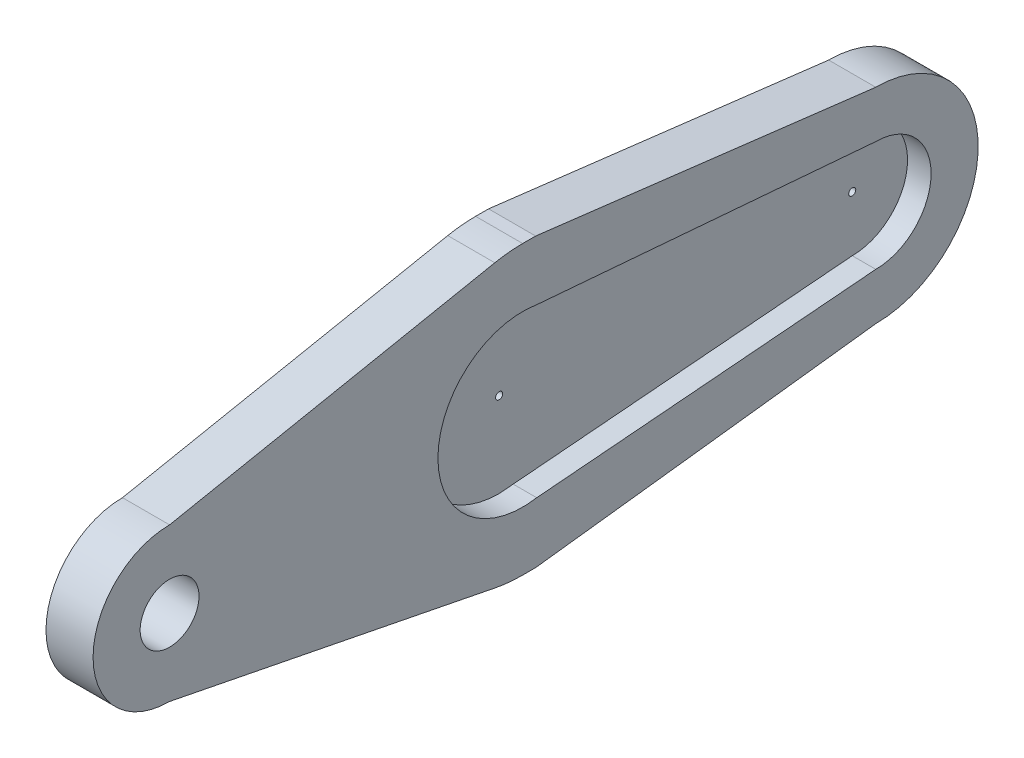
ISO-10303-21;
HEADER;
FILE_DESCRIPTION(('STEP AP214'),'2;1');
FILE_NAME('part.step','',(''),(''),'','','');
FILE_SCHEMA(('AUTOMOTIVE_DESIGN { 1 0 10303 214 1 1 1 1 }'));
ENDSEC;
DATA;
#1=APPLICATION_CONTEXT('core data for automotive mechanical design processes');
#2=APPLICATION_PROTOCOL_DEFINITION('international standard','automotive_design',2000,#1);
#3=PRODUCT_CONTEXT('',#1,'mechanical');
#4=PRODUCT('Part','Part','',(#3));
#5=PRODUCT_RELATED_PRODUCT_CATEGORY('part','',(#4));
#6=PRODUCT_DEFINITION_FORMATION('','',#4);
#7=PRODUCT_DEFINITION_CONTEXT('part definition',#1,'design');
#8=PRODUCT_DEFINITION('design','',#6,#7);
#9=PRODUCT_DEFINITION_SHAPE('','',#8);
#10=(LENGTH_UNIT() NAMED_UNIT(*) SI_UNIT(.MILLI.,.METRE.));
#11=(NAMED_UNIT(*) PLANE_ANGLE_UNIT() SI_UNIT($,.RADIAN.));
#12=(NAMED_UNIT(*) SI_UNIT($,.STERADIAN.) SOLID_ANGLE_UNIT());
#13=UNCERTAINTY_MEASURE_WITH_UNIT(LENGTH_MEASURE(1.E-05),#10,'distance_accuracy_value','');
#14=(GEOMETRIC_REPRESENTATION_CONTEXT(3) GLOBAL_UNCERTAINTY_ASSIGNED_CONTEXT((#13)) GLOBAL_UNIT_ASSIGNED_CONTEXT((#10,
#11,#12)) REPRESENTATION_CONTEXT('',''));
#15=CARTESIAN_POINT('',(0.,0.,0.));
#16=DIRECTION('',(0.,0.,1.));
#17=DIRECTION('',(1.,0.,0.));
#18=AXIS2_PLACEMENT_3D('',#15,#16,#17);
#19=CARTESIAN_POINT('',(2.,0.,0.549999999999999));
#20=DIRECTION('',(-1.,0.,0.));
#21=DIRECTION('',(0.,0.,1.));
#22=AXIS2_PLACEMENT_3D('',#19,#20,#21);
#23=CYLINDRICAL_SURFACE('',#22,3.6);
#24=CARTESIAN_POINT('',(0.,0.,0.549999999999999));
#25=DIRECTION('',(1.,0.,0.));
#26=DIRECTION('',(0.,0.,-1.));
#27=AXIS2_PLACEMENT_3D('',#24,#25,#26);
#28=CIRCLE('',#27,3.6);
#29=CARTESIAN_POINT('',(0.,-3.6,0.549999999999999));
#30=VERTEX_POINT('',#29);
#31=CARTESIAN_POINT('',(0.,-3.55034482758621,-0.0458620689654888));
#32=VERTEX_POINT('',#31);
#33=EDGE_CURVE('E189',#30,#32,#28,.T.);
#34=ORIENTED_EDGE('',*,*,#33,.F.);
#35=DIRECTION('',(-1.,0.,0.));
#36=VECTOR('',#35,1.);
#37=CARTESIAN_POINT('',(1.,-3.6,0.549999999999999));
#38=LINE('',#37,#36);
#39=CARTESIAN_POINT('',(1.,-3.6,0.549999999999999));
#40=VERTEX_POINT('',#39);
#41=EDGE_CURVE('E324',#40,#30,#38,.T.);
#42=ORIENTED_EDGE('',*,*,#41,.F.);
#43=CARTESIAN_POINT('',(1.,0.,0.549999999999999));
#44=DIRECTION('',(1.,0.,0.));
#45=DIRECTION('',(0.,0.,-1.));
#46=AXIS2_PLACEMENT_3D('',#43,#44,#45);
#47=CIRCLE('',#46,3.6);
#48=CARTESIAN_POINT('',(1.,3.6,0.549999999999999));
#49=VERTEX_POINT('',#48);
#50=EDGE_CURVE('E305',#49,#40,#47,.T.);
#51=ORIENTED_EDGE('',*,*,#50,.F.);
#52=DIRECTION('',(-1.,0.,0.));
#53=VECTOR('',#52,1.);
#54=CARTESIAN_POINT('',(1.,3.6,0.549999999999999));
#55=LINE('',#54,#53);
#56=CARTESIAN_POINT('',(0.,3.6,0.549999999999999));
#57=VERTEX_POINT('',#56);
#58=EDGE_CURVE('E332',#49,#57,#55,.T.);
#59=ORIENTED_EDGE('',*,*,#58,.T.);
#60=CARTESIAN_POINT('',(0.,3.55034482758621,-0.0458620689654861));
#61=VERTEX_POINT('',#60);
#62=EDGE_CURVE('E191',#61,#57,#28,.T.);
#63=ORIENTED_EDGE('',*,*,#62,.F.);
#64=DIRECTION('',(-1.,0.,0.));
#65=VECTOR('',#64,1.);
#66=CARTESIAN_POINT('',(2.,3.55034482758621,-0.0458620689654944));
#67=LINE('',#66,#65);
#68=CARTESIAN_POINT('',(1.,3.55034482758621,-0.0458620689654861));
#69=VERTEX_POINT('',#68);
#70=EDGE_CURVE('E301',#61,#69,#67,.F.);
#71=ORIENTED_EDGE('',*,*,#70,.T.);
#72=DIRECTION('',(-1.,0.,0.));
#73=VECTOR('',#72,1.);
#74=CARTESIAN_POINT('',(2.,3.55034482758621,-0.0458620689654861));
#75=LINE('',#74,#73);
#76=CARTESIAN_POINT('',(2.,3.55034482758621,-0.0458620689654861));
#77=VERTEX_POINT('',#76);
#78=EDGE_CURVE('E255',#77,#69,#75,.T.);
#79=ORIENTED_EDGE('',*,*,#78,.F.);
#80=CARTESIAN_POINT('',(2.,0.,0.549999999999999));
#81=DIRECTION('',(1.,0.,0.));
#82=DIRECTION('',(0.,0.,-1.));
#83=AXIS2_PLACEMENT_3D('',#80,#81,#82);
#84=CIRCLE('',#83,3.6);
#85=CARTESIAN_POINT('',(2.,-3.55034482758621,-0.0458620689654945));
#86=VERTEX_POINT('',#85);
#87=EDGE_CURVE('E347',#77,#86,#84,.T.);
#88=ORIENTED_EDGE('',*,*,#87,.T.);
#89=DIRECTION('',(-1.,0.,0.));
#90=VECTOR('',#89,1.);
#91=CARTESIAN_POINT('',(2.,-3.55034482758621,-0.0458620689654945));
#92=LINE('',#91,#90);
#93=CARTESIAN_POINT('',(1.,-3.55034482758621,-0.0458620689654945));
#94=VERTEX_POINT('',#93);
#95=EDGE_CURVE('E258',#86,#94,#92,.T.);
#96=ORIENTED_EDGE('',*,*,#95,.T.);
#97=DIRECTION('',(-1.,0.,0.));
#98=VECTOR('',#97,1.);
#99=CARTESIAN_POINT('',(2.,-3.55034482758621,-0.0458620689654999));
#100=LINE('',#99,#98);
#101=EDGE_CURVE('E190',#94,#32,#100,.T.);
#102=ORIENTED_EDGE('',*,*,#101,.T.);
#103=EDGE_LOOP('',(#34,#42,#51,#59,#63,#71,#79,#88,#96,#102));
#104=FACE_BOUND('',#103,.T.);
#105=ADVANCED_FACE('F43',(#104),#23,.F.);
#106=CARTESIAN_POINT('',(2.,6.1,0.));
#107=DIRECTION('',(0.,-1.,0.));
#108=DIRECTION('',(0.,0.,-1.));
#109=AXIS2_PLACEMENT_3D('',#106,#107,#108);
#110=PLANE('',#109);
#111=DIRECTION('',(0.,0.,1.));
#112=VECTOR('',#111,1.);
#113=CARTESIAN_POINT('',(0.,6.1,0.));
#114=LINE('',#113,#112);
#115=CARTESIAN_POINT('',(0.,6.1,0.));
#116=VERTEX_POINT('',#115);
#117=CARTESIAN_POINT('',(0.,6.1,0.549999999999999));
#118=VERTEX_POINT('',#117);
#119=EDGE_CURVE('E195',#116,#118,#114,.T.);
#120=ORIENTED_EDGE('',*,*,#119,.T.);
#121=DIRECTION('',(-1.,0.,0.));
#122=VECTOR('',#121,1.);
#123=CARTESIAN_POINT('',(2.,6.1,0.549999999999999));
#124=LINE('',#123,#122);
#125=CARTESIAN_POINT('',(2.,6.1,0.549999999999999));
#126=VERTEX_POINT('',#125);
#127=EDGE_CURVE('E11',#126,#118,#124,.T.);
#128=ORIENTED_EDGE('',*,*,#127,.F.);
#129=DIRECTION('',(0.,0.,1.));
#130=VECTOR('',#129,1.);
#131=CARTESIAN_POINT('',(2.,6.1,0.));
#132=LINE('',#131,#130);
#133=CARTESIAN_POINT('',(2.,6.1,0.));
#134=VERTEX_POINT('',#133);
#135=EDGE_CURVE('E354',#134,#126,#132,.T.);
#136=ORIENTED_EDGE('',*,*,#135,.F.);
#137=DIRECTION('',(-1.,0.,0.));
#138=VECTOR('',#137,1.);
#139=CARTESIAN_POINT('',(2.,6.1,0.));
#140=LINE('',#139,#138);
#141=EDGE_CURVE('E227',#134,#116,#140,.T.);
#142=ORIENTED_EDGE('',*,*,#141,.T.);
#143=EDGE_LOOP('',(#120,#128,#136,#142));
#144=FACE_BOUND('',#143,.T.);
#145=ADVANCED_FACE('F384',(#144),#110,.F.);
#146=CARTESIAN_POINT('',(2.,0.,0.549999999999999));
#147=DIRECTION('',(-1.,0.,0.));
#148=DIRECTION('',(0.,0.,1.));
#149=AXIS2_PLACEMENT_3D('',#146,#147,#148);
#150=CYLINDRICAL_SURFACE('',#149,6.1);
#151=CARTESIAN_POINT('',(0.,0.,0.549999999999999));
#152=DIRECTION('',(1.,0.,0.));
#153=DIRECTION('',(0.,0.,-1.));
#154=AXIS2_PLACEMENT_3D('',#151,#152,#153);
#155=CIRCLE('',#154,6.1);
#156=CARTESIAN_POINT('',(0.,5.98396265759772,1.73414142418716));
#157=VERTEX_POINT('',#156);
#158=EDGE_CURVE('E199',#118,#157,#155,.T.);
#159=ORIENTED_EDGE('',*,*,#158,.T.);
#160=DIRECTION('',(-1.,0.,0.));
#161=VECTOR('',#160,1.);
#162=CARTESIAN_POINT('',(2.,5.98396265759772,1.73414142418716));
#163=LINE('',#162,#161);
#164=CARTESIAN_POINT('',(2.,5.98396265759772,1.73414142418716));
#165=VERTEX_POINT('',#164);
#166=EDGE_CURVE('E53',#165,#157,#163,.T.);
#167=ORIENTED_EDGE('',*,*,#166,.F.);
#168=CARTESIAN_POINT('',(2.,0.,0.549999999999999));
#169=DIRECTION('',(1.,0.,0.));
#170=DIRECTION('',(0.,0.,-1.));
#171=AXIS2_PLACEMENT_3D('',#168,#169,#170);
#172=CIRCLE('',#171,6.1);
#173=EDGE_CURVE('E357',#126,#165,#172,.T.);
#174=ORIENTED_EDGE('',*,*,#173,.F.);
#175=ORIENTED_EDGE('',*,*,#127,.T.);
#176=EDGE_LOOP('',(#159,#167,#174,#175));
#177=FACE_BOUND('',#176,.T.);
#178=ADVANCED_FACE('F389',(#177),#150,.T.);
#179=CARTESIAN_POINT('',(2.,6.08869853330339,1.20486717000446));
#180=DIRECTION('',(0.,-0.980977484852086,-0.194121544948715));
#181=DIRECTION('',(0.,0.194121544948715,-0.980977484852086));
#182=AXIS2_PLACEMENT_3D('',#179,#180,#181);
#183=PLANE('',#182);
#184=DIRECTION('',(0.,-0.194121544948715,0.980977484852086));
#185=VECTOR('',#184,1.);
#186=CARTESIAN_POINT('',(0.,6.08869853330339,1.20486717000446));
#187=LINE('',#186,#185);
#188=CARTESIAN_POINT('',(0.,3.25,15.55));
#189=VERTEX_POINT('',#188);
#190=EDGE_CURVE('E202',#157,#189,#187,.T.);
#191=ORIENTED_EDGE('',*,*,#190,.T.);
#192=DIRECTION('',(-1.,0.,0.));
#193=VECTOR('',#192,1.);
#194=CARTESIAN_POINT('',(2.,3.25,15.55));
#195=LINE('',#194,#193);
#196=CARTESIAN_POINT('',(2.,3.25,15.55));
#197=VERTEX_POINT('',#196);
#198=EDGE_CURVE('E245',#197,#189,#195,.T.);
#199=ORIENTED_EDGE('',*,*,#198,.F.);
#200=DIRECTION('',(0.,-0.194121544948715,0.980977484852086));
#201=VECTOR('',#200,1.);
#202=CARTESIAN_POINT('',(2.,6.08869853330339,1.20486717000446));
#203=LINE('',#202,#201);
#204=EDGE_CURVE('E360',#165,#197,#203,.T.);
#205=ORIENTED_EDGE('',*,*,#204,.F.);
#206=ORIENTED_EDGE('',*,*,#166,.T.);
#207=EDGE_LOOP('',(#191,#199,#205,#206));
#208=FACE_BOUND('',#207,.T.);
#209=ADVANCED_FACE('F392',(#208),#183,.F.);
#210=CARTESIAN_POINT('',(2.,0.,15.55));
#211=DIRECTION('',(-1.,0.,0.));
#212=DIRECTION('',(0.,0.,1.));
#213=AXIS2_PLACEMENT_3D('',#210,#211,#212);
#214=CYLINDRICAL_SURFACE('',#213,3.25);
#215=CARTESIAN_POINT('',(0.,0.,15.55));
#216=DIRECTION('',(1.,0.,0.));
#217=DIRECTION('',(0.,0.,-1.));
#218=AXIS2_PLACEMENT_3D('',#215,#216,#217);
#219=CIRCLE('',#218,3.25);
#220=CARTESIAN_POINT('',(0.,-3.25,15.55));
#221=VERTEX_POINT('',#220);
#222=EDGE_CURVE('E205',#189,#221,#219,.T.);
#223=ORIENTED_EDGE('',*,*,#222,.T.);
#224=DIRECTION('',(-1.,0.,0.));
#225=VECTOR('',#224,1.);
#226=CARTESIAN_POINT('',(2.,-3.25,15.55));
#227=LINE('',#226,#225);
#228=CARTESIAN_POINT('',(2.,-3.25,15.55));
#229=VERTEX_POINT('',#228);
#230=EDGE_CURVE('E241',#229,#221,#227,.T.);
#231=ORIENTED_EDGE('',*,*,#230,.F.);
#232=CARTESIAN_POINT('',(2.,0.,15.55));
#233=DIRECTION('',(1.,0.,0.));
#234=DIRECTION('',(0.,0.,-1.));
#235=AXIS2_PLACEMENT_3D('',#232,#233,#234);
#236=CIRCLE('',#235,3.25);
#237=EDGE_CURVE('E363',#197,#229,#236,.T.);
#238=ORIENTED_EDGE('',*,*,#237,.F.);
#239=ORIENTED_EDGE('',*,*,#198,.T.);
#240=EDGE_LOOP('',(#223,#231,#238,#239));
#241=FACE_BOUND('',#240,.T.);
#242=ADVANCED_FACE('F397',(#241),#214,.T.);
#243=CARTESIAN_POINT('',(2.,-6.08869853330339,1.20486717000446));
#244=DIRECTION('',(0.,0.980977484852086,-0.194121544948715));
#245=DIRECTION('',(0.,0.194121544948715,0.980977484852086));
#246=AXIS2_PLACEMENT_3D('',#243,#244,#245);
#247=PLANE('',#246);
#248=DIRECTION('',(0.,-0.194121544948715,-0.980977484852086));
#249=VECTOR('',#248,1.);
#250=CARTESIAN_POINT('',(0.,-6.08869853330339,1.20486717000446));
#251=LINE('',#250,#249);
#252=CARTESIAN_POINT('',(0.,-5.98396265759773,1.73414142418716));
#253=VERTEX_POINT('',#252);
#254=EDGE_CURVE('E208',#221,#253,#251,.T.);
#255=ORIENTED_EDGE('',*,*,#254,.T.);
#256=DIRECTION('',(-1.,0.,0.));
#257=VECTOR('',#256,1.);
#258=CARTESIAN_POINT('',(2.,-5.98396265759773,1.73414142418716));
#259=LINE('',#258,#257);
#260=CARTESIAN_POINT('',(2.,-5.98396265759773,1.73414142418716));
#261=VERTEX_POINT('',#260);
#262=EDGE_CURVE('E237',#261,#253,#259,.T.);
#263=ORIENTED_EDGE('',*,*,#262,.F.);
#264=DIRECTION('',(0.,-0.194121544948715,-0.980977484852086));
#265=VECTOR('',#264,1.);
#266=CARTESIAN_POINT('',(2.,-6.08869853330339,1.20486717000446));
#267=LINE('',#266,#265);
#268=EDGE_CURVE('E366',#229,#261,#267,.T.);
#269=ORIENTED_EDGE('',*,*,#268,.F.);
#270=ORIENTED_EDGE('',*,*,#230,.T.);
#271=EDGE_LOOP('',(#255,#263,#269,#270));
#272=FACE_BOUND('',#271,.T.);
#273=ADVANCED_FACE('F402',(#272),#247,.F.);
#274=CARTESIAN_POINT('',(2.,0.,0.549999999999999));
#275=DIRECTION('',(-1.,0.,0.));
#276=DIRECTION('',(0.,0.,1.));
#277=AXIS2_PLACEMENT_3D('',#274,#275,#276);
#278=CYLINDRICAL_SURFACE('',#277,6.1);
#279=CARTESIAN_POINT('',(0.,0.,0.549999999999999));
#280=DIRECTION('',(1.,0.,0.));
#281=DIRECTION('',(0.,0.,-1.));
#282=AXIS2_PLACEMENT_3D('',#279,#280,#281);
#283=CIRCLE('',#282,6.1);
#284=CARTESIAN_POINT('',(0.,-6.1,0.549999999999999));
#285=VERTEX_POINT('',#284);
#286=EDGE_CURVE('E211',#253,#285,#283,.T.);
#287=ORIENTED_EDGE('',*,*,#286,.T.);
#288=DIRECTION('',(-1.,0.,0.));
#289=VECTOR('',#288,1.);
#290=CARTESIAN_POINT('',(2.,-6.1,0.549999999999999));
#291=LINE('',#290,#289);
#292=CARTESIAN_POINT('',(2.,-6.1,0.549999999999999));
#293=VERTEX_POINT('',#292);
#294=EDGE_CURVE('E234',#293,#285,#291,.T.);
#295=ORIENTED_EDGE('',*,*,#294,.F.);
#296=CARTESIAN_POINT('',(2.,0.,0.549999999999999));
#297=DIRECTION('',(1.,0.,0.));
#298=DIRECTION('',(0.,0.,-1.));
#299=AXIS2_PLACEMENT_3D('',#296,#297,#298);
#300=CIRCLE('',#299,6.1);
#301=EDGE_CURVE('E369',#261,#293,#300,.T.);
#302=ORIENTED_EDGE('',*,*,#301,.F.);
#303=ORIENTED_EDGE('',*,*,#262,.T.);
#304=EDGE_LOOP('',(#287,#295,#302,#303));
#305=FACE_BOUND('',#304,.T.);
#306=ADVANCED_FACE('F405',(#305),#278,.T.);
#307=CARTESIAN_POINT('',(2.,-6.1,0.));
#308=DIRECTION('',(0.,-1.,0.));
#309=DIRECTION('',(0.,0.,-1.));
#310=AXIS2_PLACEMENT_3D('',#307,#308,#309);
#311=PLANE('',#310);
#312=DIRECTION('',(0.,0.,1.));
#313=VECTOR('',#312,1.);
#314=CARTESIAN_POINT('',(0.,-6.1,0.));
#315=LINE('',#314,#313);
#316=CARTESIAN_POINT('',(0.,-6.1,0.));
#317=VERTEX_POINT('',#316);
#318=EDGE_CURVE('E215',#317,#285,#315,.T.);
#319=ORIENTED_EDGE('',*,*,#318,.F.);
#320=DIRECTION('',(-1.,0.,0.));
#321=VECTOR('',#320,1.);
#322=CARTESIAN_POINT('',(2.,-6.1,0.));
#323=LINE('',#322,#321);
#324=CARTESIAN_POINT('',(2.,-6.1,0.));
#325=VERTEX_POINT('',#324);
#326=EDGE_CURVE('E174',#325,#317,#323,.T.);
#327=ORIENTED_EDGE('',*,*,#326,.F.);
#328=DIRECTION('',(0.,0.,1.));
#329=VECTOR('',#328,1.);
#330=CARTESIAN_POINT('',(2.,-6.1,0.));
#331=LINE('',#330,#329);
#332=EDGE_CURVE('E162',#325,#293,#331,.T.);
#333=ORIENTED_EDGE('',*,*,#332,.T.);
#334=ORIENTED_EDGE('',*,*,#294,.T.);
#335=EDGE_LOOP('',(#319,#327,#333,#334));
#336=FACE_BOUND('',#335,.T.);
#337=ADVANCED_FACE('F374',(#336),#311,.T.);
#338=CARTESIAN_POINT('',(2.,-6.01182474689071,-0.728075661388148));
#339=DIRECTION('',(0.,0.992746211513238,0.12022877994105));
#340=DIRECTION('',(0.,-0.12022877994105,0.992746211513238));
#341=AXIS2_PLACEMENT_3D('',#338,#339,#340);
#342=PLANE('',#341);
#343=DIRECTION('',(0.,0.12022877994105,-0.992746211513238));
#344=VECTOR('',#343,1.);
#345=CARTESIAN_POINT('',(0.,-6.01182474689071,-0.728075661388148));
#346=LINE('',#345,#344);
#347=CARTESIAN_POINT('',(0.,-4.35,-14.45));
#348=VERTEX_POINT('',#347);
#349=EDGE_CURVE('E170',#317,#348,#346,.T.);
#350=ORIENTED_EDGE('',*,*,#349,.T.);
#351=DIRECTION('',(-1.,0.,0.));
#352=VECTOR('',#351,1.);
#353=CARTESIAN_POINT('',(2.,-4.35,-14.45));
#354=LINE('',#353,#352);
#355=CARTESIAN_POINT('',(2.,-4.35,-14.45));
#356=VERTEX_POINT('',#355);
#357=EDGE_CURVE('E167',#356,#348,#354,.T.);
#358=ORIENTED_EDGE('',*,*,#357,.F.);
#359=DIRECTION('',(0.,0.12022877994105,-0.992746211513238));
#360=VECTOR('',#359,1.);
#361=CARTESIAN_POINT('',(2.,-6.01182474689071,-0.728075661388148));
#362=LINE('',#361,#360);
#363=EDGE_CURVE('E155',#325,#356,#362,.T.);
#364=ORIENTED_EDGE('',*,*,#363,.F.);
#365=ORIENTED_EDGE('',*,*,#326,.T.);
#366=EDGE_LOOP('',(#350,#358,#364,#365));
#367=FACE_BOUND('',#366,.T.);
#368=ADVANCED_FACE('F168',(#367),#342,.F.);
#369=CARTESIAN_POINT('',(2.,0.,-14.45));
#370=DIRECTION('',(-1.,0.,0.));
#371=DIRECTION('',(0.,0.,1.));
#372=AXIS2_PLACEMENT_3D('',#369,#370,#371);
#373=CYLINDRICAL_SURFACE('',#372,4.35);
#374=CARTESIAN_POINT('',(0.,0.,-14.45));
#375=DIRECTION('',(1.,0.,0.));
#376=DIRECTION('',(0.,0.,-1.));
#377=AXIS2_PLACEMENT_3D('',#374,#375,#376);
#378=CIRCLE('',#377,4.35);
#379=CARTESIAN_POINT('',(0.,4.35,-14.45));
#380=VERTEX_POINT('',#379);
#381=EDGE_CURVE('E221',#348,#380,#378,.T.);
#382=ORIENTED_EDGE('',*,*,#381,.T.);
#383=DIRECTION('',(-1.,0.,0.));
#384=VECTOR('',#383,1.);
#385=CARTESIAN_POINT('',(2.,4.35,-14.45));
#386=LINE('',#385,#384);
#387=CARTESIAN_POINT('',(2.,4.35,-14.45));
#388=VERTEX_POINT('',#387);
#389=EDGE_CURVE('E175',#388,#380,#386,.T.);
#390=ORIENTED_EDGE('',*,*,#389,.F.);
#391=CARTESIAN_POINT('',(2.,0.,-14.45));
#392=DIRECTION('',(1.,0.,0.));
#393=DIRECTION('',(0.,0.,-1.));
#394=AXIS2_PLACEMENT_3D('',#391,#392,#393);
#395=CIRCLE('',#394,4.35);
#396=EDGE_CURVE('E159',#356,#388,#395,.T.);
#397=ORIENTED_EDGE('',*,*,#396,.F.);
#398=ORIENTED_EDGE('',*,*,#357,.T.);
#399=EDGE_LOOP('',(#382,#390,#397,#398));
#400=FACE_BOUND('',#399,.T.);
#401=ADVANCED_FACE('F177',(#400),#373,.T.);
#402=CARTESIAN_POINT('',(2.,0.,-14.45));
#403=DIRECTION('',(-1.,0.,0.));
#404=DIRECTION('',(0.,0.,1.));
#405=AXIS2_PLACEMENT_3D('',#402,#403,#404);
#406=CYLINDRICAL_SURFACE('',#405,2.35);
#407=CARTESIAN_POINT('',(1.,0.,-14.45));
#408=DIRECTION('',(1.,0.,0.));
#409=DIRECTION('',(0.,0.,-1.));
#410=AXIS2_PLACEMENT_3D('',#407,#408,#409);
#411=CIRCLE('',#410,2.35);
#412=CARTESIAN_POINT('',(1.,-2.35,-14.45));
#413=VERTEX_POINT('',#412);
#414=CARTESIAN_POINT('',(1.,2.35,-14.45));
#415=VERTEX_POINT('',#414);
#416=EDGE_CURVE('E307',#413,#415,#411,.T.);
#417=ORIENTED_EDGE('',*,*,#416,.F.);
#418=DIRECTION('',(-1.,0.,0.));
#419=VECTOR('',#418,1.);
#420=CARTESIAN_POINT('',(2.,-2.35,-14.45));
#421=LINE('',#420,#419);
#422=CARTESIAN_POINT('',(2.,-2.35,-14.45));
#423=VERTEX_POINT('',#422);
#424=EDGE_CURVE('E47',#423,#413,#421,.T.);
#425=ORIENTED_EDGE('',*,*,#424,.F.);
#426=CARTESIAN_POINT('',(2.,0.,-14.45));
#427=DIRECTION('',(1.,0.,0.));
#428=DIRECTION('',(0.,0.,-1.));
#429=AXIS2_PLACEMENT_3D('',#426,#427,#428);
#430=CIRCLE('',#429,2.35);
#431=CARTESIAN_POINT('',(2.,2.35,-14.45));
#432=VERTEX_POINT('',#431);
#433=EDGE_CURVE('E342',#423,#432,#430,.T.);
#434=ORIENTED_EDGE('',*,*,#433,.T.);
#435=DIRECTION('',(-1.,0.,0.));
#436=VECTOR('',#435,1.);
#437=CARTESIAN_POINT('',(2.,2.35,-14.45));
#438=LINE('',#437,#436);
#439=EDGE_CURVE('E181',#432,#415,#438,.T.);
#440=ORIENTED_EDGE('',*,*,#439,.T.);
#441=EDGE_LOOP('',(#417,#425,#434,#440));
#442=FACE_BOUND('',#441,.T.);
#443=ADVANCED_FACE('F426',(#442),#406,.F.);
#444=CARTESIAN_POINT('',(2.,-3.52965517241379,-0.294137931034483));
#445=DIRECTION('',(0.,0.99654575824488,0.0830454798537399));
#446=DIRECTION('',(0.,-0.08304547985374,0.99654575824488));
#447=AXIS2_PLACEMENT_3D('',#444,#445,#446);
#448=PLANE('',#447);
#449=DIRECTION('',(0.,0.08304547985374,-0.99654575824488));
#450=VECTOR('',#449,1.);
#451=CARTESIAN_POINT('',(1.,-3.52965517241379,-0.294137931034483));
#452=LINE('',#451,#450);
#453=EDGE_CURVE('E271',#94,#413,#452,.T.);
#454=ORIENTED_EDGE('',*,*,#453,.F.);
#455=ORIENTED_EDGE('',*,*,#95,.F.);
#456=DIRECTION('',(0.,0.08304547985374,-0.99654575824488));
#457=VECTOR('',#456,1.);
#458=CARTESIAN_POINT('',(2.,-3.52965517241379,-0.294137931034483));
#459=LINE('',#458,#457);
#460=EDGE_CURVE('E273',#86,#423,#459,.T.);
#461=ORIENTED_EDGE('',*,*,#460,.T.);
#462=ORIENTED_EDGE('',*,*,#424,.T.);
#463=EDGE_LOOP('',(#454,#455,#461,#462));
#464=FACE_BOUND('',#463,.T.);
#465=ADVANCED_FACE('F269',(#464),#448,.T.);
#466=CARTESIAN_POINT('',(2.,3.52965517241379,-0.294137931034483));
#467=DIRECTION('',(0.,-0.99654575824488,0.0830454798537399));
#468=DIRECTION('',(0.,-0.08304547985374,-0.99654575824488));
#469=AXIS2_PLACEMENT_3D('',#466,#467,#468);
#470=PLANE('',#469);
#471=DIRECTION('',(0.,0.08304547985374,0.99654575824488));
#472=VECTOR('',#471,1.);
#473=CARTESIAN_POINT('',(1.,3.52965517241379,-0.294137931034483));
#474=LINE('',#473,#472);
#475=EDGE_CURVE('E318',#415,#69,#474,.T.);
#476=ORIENTED_EDGE('',*,*,#475,.F.);
#477=ORIENTED_EDGE('',*,*,#439,.F.);
#478=DIRECTION('',(0.,0.08304547985374,0.99654575824488));
#479=VECTOR('',#478,1.);
#480=CARTESIAN_POINT('',(2.,3.52965517241379,-0.294137931034483));
#481=LINE('',#480,#479);
#482=EDGE_CURVE('E350',#432,#77,#481,.T.);
#483=ORIENTED_EDGE('',*,*,#482,.T.);
#484=ORIENTED_EDGE('',*,*,#78,.T.);
#485=EDGE_LOOP('',(#476,#477,#483,#484));
#486=FACE_BOUND('',#485,.T.);
#487=ADVANCED_FACE('F424',(#486),#470,.T.);
#488=CARTESIAN_POINT('',(2.,0.,15.55));
#489=DIRECTION('',(-1.,0.,0.));
#490=DIRECTION('',(0.,0.,1.));
#491=AXIS2_PLACEMENT_3D('',#488,#489,#490);
#492=CYLINDRICAL_SURFACE('',#491,1.25);
#493=CARTESIAN_POINT('',(2.,0.,15.55));
#494=DIRECTION('',(1.,0.,0.));
#495=DIRECTION('',(0.,0.,-1.));
#496=AXIS2_PLACEMENT_3D('',#493,#494,#495);
#497=CIRCLE('',#496,1.25);
#498=CARTESIAN_POINT('',(2.,0.,14.3));
#499=VERTEX_POINT('',#498);
#500=EDGE_CURVE('E226',#499,#499,#497,.T.);
#501=ORIENTED_EDGE('',*,*,#500,.T.);
#502=EDGE_LOOP('',(#501));
#503=FACE_BOUND('',#502,.T.);
#504=CARTESIAN_POINT('',(0.,0.,15.55));
#505=DIRECTION('',(1.,0.,0.));
#506=DIRECTION('',(0.,0.,-1.));
#507=AXIS2_PLACEMENT_3D('',#504,#505,#506);
#508=CIRCLE('',#507,1.25);
#509=CARTESIAN_POINT('',(0.,0.,14.3));
#510=VERTEX_POINT('',#509);
#511=EDGE_CURVE('E185',#510,#510,#508,.T.);
#512=ORIENTED_EDGE('',*,*,#511,.F.);
#513=EDGE_LOOP('',(#512));
#514=FACE_BOUND('',#513,.T.);
#515=ADVANCED_FACE('F45',(#503,#514),#492,.F.);
#516=CARTESIAN_POINT('',(2.,6.01182474689071,-0.728075661388148));
#517=DIRECTION('',(0.,-0.992746211513238,0.12022877994105));
#518=DIRECTION('',(0.,-0.12022877994105,-0.992746211513238));
#519=AXIS2_PLACEMENT_3D('',#516,#517,#518);
#520=PLANE('',#519);
#521=DIRECTION('',(0.,0.12022877994105,0.992746211513238));
#522=VECTOR('',#521,1.);
#523=CARTESIAN_POINT('',(0.,6.01182474689071,-0.728075661388148));
#524=LINE('',#523,#522);
#525=EDGE_CURVE('E111',#380,#116,#524,.T.);
#526=ORIENTED_EDGE('',*,*,#525,.T.);
#527=ORIENTED_EDGE('',*,*,#141,.F.);
#528=DIRECTION('',(0.,0.12022877994105,0.992746211513238));
#529=VECTOR('',#528,1.);
#530=CARTESIAN_POINT('',(2.,6.01182474689071,-0.728075661388148));
#531=LINE('',#530,#529);
#532=EDGE_CURVE('E69',#388,#134,#531,.T.);
#533=ORIENTED_EDGE('',*,*,#532,.F.);
#534=ORIENTED_EDGE('',*,*,#389,.T.);
#535=EDGE_LOOP('',(#526,#527,#533,#534));
#536=FACE_BOUND('',#535,.T.);
#537=ADVANCED_FACE('F380',(#536),#520,.F.);
#538=CARTESIAN_POINT('',(2.,0.,0.));
#539=DIRECTION('',(1.,0.,0.));
#540=DIRECTION('',(0.,0.,-1.));
#541=AXIS2_PLACEMENT_3D('',#538,#539,#540);
#542=PLANE('',#541);
#543=ORIENTED_EDGE('',*,*,#500,.F.);
#544=EDGE_LOOP('',(#543));
#545=FACE_BOUND('',#544,.T.);
#546=ORIENTED_EDGE('',*,*,#433,.F.);
#547=ORIENTED_EDGE('',*,*,#460,.F.);
#548=ORIENTED_EDGE('',*,*,#87,.F.);
#549=ORIENTED_EDGE('',*,*,#482,.F.);
#550=EDGE_LOOP('',(#546,#547,#548,#549));
#551=FACE_BOUND('',#550,.T.);
#552=ORIENTED_EDGE('',*,*,#135,.T.);
#553=ORIENTED_EDGE('',*,*,#173,.T.);
#554=ORIENTED_EDGE('',*,*,#204,.T.);
#555=ORIENTED_EDGE('',*,*,#237,.T.);
#556=ORIENTED_EDGE('',*,*,#268,.T.);
#557=ORIENTED_EDGE('',*,*,#301,.T.);
#558=ORIENTED_EDGE('',*,*,#332,.F.);
#559=ORIENTED_EDGE('',*,*,#363,.T.);
#560=ORIENTED_EDGE('',*,*,#396,.T.);
#561=ORIENTED_EDGE('',*,*,#532,.T.);
#562=EDGE_LOOP('',(#552,#553,#554,#555,#556,#557,#558,#559,#560,#561));
#563=FACE_BOUND('',#562,.T.);
#564=ADVANCED_FACE('F157',(#545,#551,#563),#542,.T.);
#565=CARTESIAN_POINT('',(0.,0.,0.));
#566=DIRECTION('',(1.,0.,0.));
#567=DIRECTION('',(0.,0.,-1.));
#568=AXIS2_PLACEMENT_3D('',#565,#566,#567);
#569=PLANE('',#568);
#570=DIRECTION('',(0.,0.08304547985374,0.99654575824488));
#571=VECTOR('',#570,1.);
#572=CARTESIAN_POINT('',(0.,3.52965517241379,-0.294137931034483));
#573=LINE('',#572,#571);
#574=EDGE_CURVE('E313',#61,#57,#573,.T.);
#575=ORIENTED_EDGE('',*,*,#574,.F.);
#576=ORIENTED_EDGE('',*,*,#62,.T.);
#577=EDGE_LOOP('',(#575,#576));
#578=FACE_BOUND('',#577,.T.);
#579=ORIENTED_EDGE('',*,*,#511,.T.);
#580=EDGE_LOOP('',(#579));
#581=FACE_BOUND('',#580,.T.);
#582=ORIENTED_EDGE('',*,*,#33,.T.);
#583=DIRECTION('',(0.,0.08304547985374,-0.99654575824488));
#584=VECTOR('',#583,1.);
#585=CARTESIAN_POINT('',(0.,-3.52965517241379,-0.294137931034483));
#586=LINE('',#585,#584);
#587=EDGE_CURVE('E60',#30,#32,#586,.T.);
#588=ORIENTED_EDGE('',*,*,#587,.F.);
#589=EDGE_LOOP('',(#582,#588));
#590=FACE_BOUND('',#589,.T.);
#591=ORIENTED_EDGE('',*,*,#119,.F.);
#592=ORIENTED_EDGE('',*,*,#525,.F.);
#593=ORIENTED_EDGE('',*,*,#381,.F.);
#594=ORIENTED_EDGE('',*,*,#349,.F.);
#595=ORIENTED_EDGE('',*,*,#318,.T.);
#596=ORIENTED_EDGE('',*,*,#286,.F.);
#597=ORIENTED_EDGE('',*,*,#254,.F.);
#598=ORIENTED_EDGE('',*,*,#222,.F.);
#599=ORIENTED_EDGE('',*,*,#190,.F.);
#600=ORIENTED_EDGE('',*,*,#158,.F.);
#601=EDGE_LOOP('',(#591,#592,#593,#594,#595,#596,#597,#598,#599,#600));
#602=FACE_BOUND('',#601,.T.);
#603=ADVANCED_FACE('F378',(#578,#581,#590,#602),#569,.F.);
#604=CARTESIAN_POINT('',(1.,-3.52965517241379,-0.294137931034483));
#605=DIRECTION('',(0.,0.99654575824488,0.0830454798537399));
#606=DIRECTION('',(0.,-0.08304547985374,0.99654575824488));
#607=AXIS2_PLACEMENT_3D('',#604,#605,#606);
#608=PLANE('',#607);
#609=ORIENTED_EDGE('',*,*,#101,.F.);
#610=EDGE_CURVE('E297',#40,#94,#452,.T.);
#611=ORIENTED_EDGE('',*,*,#610,.F.);
#612=ORIENTED_EDGE('',*,*,#41,.T.);
#613=ORIENTED_EDGE('',*,*,#587,.T.);
#614=EDGE_LOOP('',(#609,#611,#612,#613));
#615=FACE_BOUND('',#614,.T.);
#616=ADVANCED_FACE('F296',(#615),#608,.F.);
#617=CARTESIAN_POINT('',(1.,3.52965517241379,-0.294137931034483));
#618=DIRECTION('',(0.,-0.99654575824488,0.0830454798537399));
#619=DIRECTION('',(0.,-0.08304547985374,-0.99654575824488));
#620=AXIS2_PLACEMENT_3D('',#617,#618,#619);
#621=PLANE('',#620);
#622=ORIENTED_EDGE('',*,*,#70,.F.);
#623=ORIENTED_EDGE('',*,*,#574,.T.);
#624=ORIENTED_EDGE('',*,*,#58,.F.);
#625=EDGE_CURVE('E311',#69,#49,#474,.T.);
#626=ORIENTED_EDGE('',*,*,#625,.F.);
#627=EDGE_LOOP('',(#622,#623,#624,#626));
#628=FACE_BOUND('',#627,.T.);
#629=ADVANCED_FACE('F499',(#628),#621,.F.);
#630=CARTESIAN_POINT('',(1.,0.,0.));
#631=DIRECTION('',(1.,0.,0.));
#632=DIRECTION('',(0.,0.,-1.));
#633=AXIS2_PLACEMENT_3D('',#630,#631,#632);
#634=PLANE('',#633);
#635=CARTESIAN_POINT('',(1.,0.,0.549999999999999));
#636=DIRECTION('',(1.,0.,0.));
#637=DIRECTION('',(0.,0.,-1.));
#638=AXIS2_PLACEMENT_3D('',#635,#636,#637);
#639=CIRCLE('',#638,0.15);
#640=CARTESIAN_POINT('',(1.,0.,0.4));
#641=VERTEX_POINT('',#640);
#642=EDGE_CURVE('E626',#641,#641,#639,.T.);
#643=ORIENTED_EDGE('',*,*,#642,.F.);
#644=EDGE_LOOP('',(#643));
#645=FACE_BOUND('',#644,.T.);
#646=CARTESIAN_POINT('',(1.,0.,-14.45));
#647=DIRECTION('',(1.,0.,0.));
#648=DIRECTION('',(0.,0.,-1.));
#649=AXIS2_PLACEMENT_3D('',#646,#647,#648);
#650=CIRCLE('',#649,0.150000000000001);
#651=CARTESIAN_POINT('',(1.,0.,-14.6));
#652=VERTEX_POINT('',#651);
#653=EDGE_CURVE('E630',#652,#652,#650,.T.);
#654=ORIENTED_EDGE('',*,*,#653,.F.);
#655=EDGE_LOOP('',(#654));
#656=FACE_BOUND('',#655,.T.);
#657=ORIENTED_EDGE('',*,*,#610,.T.);
#658=ORIENTED_EDGE('',*,*,#453,.T.);
#659=ORIENTED_EDGE('',*,*,#416,.T.);
#660=ORIENTED_EDGE('',*,*,#475,.T.);
#661=ORIENTED_EDGE('',*,*,#625,.T.);
#662=ORIENTED_EDGE('',*,*,#50,.T.);
#663=EDGE_LOOP('',(#657,#658,#659,#660,#661,#662));
#664=FACE_BOUND('',#663,.T.);
#665=ADVANCED_FACE('F303',(#645,#656,#664),#634,.T.);
#666=CARTESIAN_POINT('',(0.5,0.,-14.45));
#667=DIRECTION('',(1.,0.,0.));
#668=DIRECTION('',(0.,0.,-1.));
#669=AXIS2_PLACEMENT_3D('',#666,#667,#668);
#670=CYLINDRICAL_SURFACE('',#669,0.150000000000001);
#671=CARTESIAN_POINT('',(0.5,0.,-14.45));
#672=DIRECTION('',(1.,0.,0.));
#673=DIRECTION('',(0.,0.,-1.));
#674=AXIS2_PLACEMENT_3D('',#671,#672,#673);
#675=CIRCLE('',#674,0.150000000000001);
#676=CARTESIAN_POINT('',(0.5,0.,-14.6));
#677=VERTEX_POINT('',#676);
#678=EDGE_CURVE('E315',#677,#677,#675,.T.);
#679=ORIENTED_EDGE('',*,*,#678,.F.);
#680=EDGE_LOOP('',(#679));
#681=FACE_BOUND('',#680,.T.);
#682=ORIENTED_EDGE('',*,*,#653,.T.);
#683=EDGE_LOOP('',(#682));
#684=FACE_BOUND('',#683,.T.);
#685=ADVANCED_FACE('F513',(#681,#684),#670,.F.);
#686=CARTESIAN_POINT('',(0.5,0.,-14.45));
#687=DIRECTION('',(1.,0.,0.));
#688=DIRECTION('',(0.,0.,-1.));
#689=AXIS2_PLACEMENT_3D('',#686,#687,#688);
#690=PLANE('',#689);
#691=ORIENTED_EDGE('',*,*,#678,.T.);
#692=EDGE_LOOP('',(#691));
#693=FACE_BOUND('',#692,.T.);
#694=ADVANCED_FACE('F522',(#693),#690,.T.);
#695=CARTESIAN_POINT('',(0.5,0.,0.549999999999999));
#696=DIRECTION('',(1.,0.,0.));
#697=DIRECTION('',(0.,0.,-1.));
#698=AXIS2_PLACEMENT_3D('',#695,#696,#697);
#699=CYLINDRICAL_SURFACE('',#698,0.15);
#700=CARTESIAN_POINT('',(0.5,0.,0.549999999999999));
#701=DIRECTION('',(1.,0.,0.));
#702=DIRECTION('',(0.,0.,-1.));
#703=AXIS2_PLACEMENT_3D('',#700,#701,#702);
#704=CIRCLE('',#703,0.15);
#705=CARTESIAN_POINT('',(0.5,0.,0.4));
#706=VERTEX_POINT('',#705);
#707=EDGE_CURVE('E327',#706,#706,#704,.T.);
#708=ORIENTED_EDGE('',*,*,#707,.F.);
#709=EDGE_LOOP('',(#708));
#710=FACE_BOUND('',#709,.T.);
#711=ORIENTED_EDGE('',*,*,#642,.T.);
#712=EDGE_LOOP('',(#711));
#713=FACE_BOUND('',#712,.T.);
#714=ADVANCED_FACE('F531',(#710,#713),#699,.F.);
#715=CARTESIAN_POINT('',(0.5,0.,0.549999999999999));
#716=DIRECTION('',(1.,0.,0.));
#717=DIRECTION('',(0.,0.,-1.));
#718=AXIS2_PLACEMENT_3D('',#715,#716,#717);
#719=PLANE('',#718);
#720=ORIENTED_EDGE('',*,*,#707,.T.);
#721=EDGE_LOOP('',(#720));
#722=FACE_BOUND('',#721,.T.);
#723=ADVANCED_FACE('F540',(#722),#719,.T.);
#724=CLOSED_SHELL('',(#105,#145,#178,#209,#242,#273,#306,#337,#368,#401,#443,#465,#487,#515,
#537,#564,#603,#616,#629,#665,#685,#694,#714,#723));
#725=MANIFOLD_SOLID_BREP('B2',#724);
#726=ADVANCED_BREP_SHAPE_REPRESENTATION('',(#18,#725),#14);
#727=SHAPE_DEFINITION_REPRESENTATION(#9,#726);
ENDSEC;
END-ISO-10303-21;
